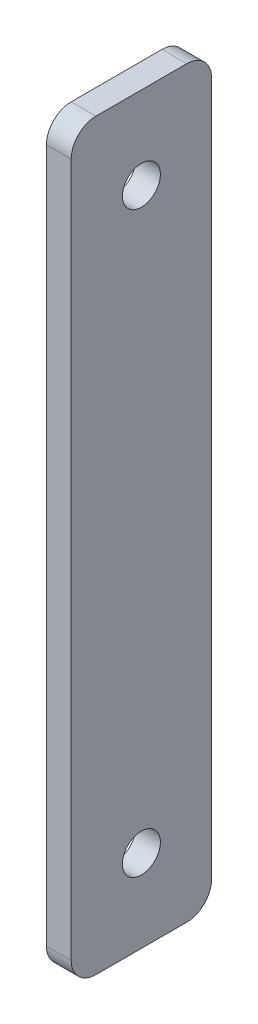
ISO-10303-21;
HEADER;
FILE_DESCRIPTION(('STEP AP214'),'2;1');
FILE_NAME('part.step','',(''),(''),'','','');
FILE_SCHEMA(('AUTOMOTIVE_DESIGN { 1 0 10303 214 1 1 1 1 }'));
ENDSEC;
DATA;
#1=APPLICATION_CONTEXT('core data for automotive mechanical design processes');
#2=APPLICATION_PROTOCOL_DEFINITION('international standard','automotive_design',2000,#1);
#3=PRODUCT_CONTEXT('',#1,'mechanical');
#4=PRODUCT('Part','Part','',(#3));
#5=PRODUCT_RELATED_PRODUCT_CATEGORY('part','',(#4));
#6=PRODUCT_DEFINITION_FORMATION('','',#4);
#7=PRODUCT_DEFINITION_CONTEXT('part definition',#1,'design');
#8=PRODUCT_DEFINITION('design','',#6,#7);
#9=PRODUCT_DEFINITION_SHAPE('','',#8);
#10=(LENGTH_UNIT() NAMED_UNIT(*) SI_UNIT(.MILLI.,.METRE.));
#11=(NAMED_UNIT(*) PLANE_ANGLE_UNIT() SI_UNIT($,.RADIAN.));
#12=(NAMED_UNIT(*) SI_UNIT($,.STERADIAN.) SOLID_ANGLE_UNIT());
#13=UNCERTAINTY_MEASURE_WITH_UNIT(LENGTH_MEASURE(1.E-05),#10,'distance_accuracy_value','');
#14=(GEOMETRIC_REPRESENTATION_CONTEXT(3) GLOBAL_UNCERTAINTY_ASSIGNED_CONTEXT((#13)) GLOBAL_UNIT_ASSIGNED_CONTEXT((#10,
#11,#12)) REPRESENTATION_CONTEXT('',''));
#15=CARTESIAN_POINT('',(0.,0.,0.));
#16=DIRECTION('',(0.,0.,1.));
#17=DIRECTION('',(1.,0.,0.));
#18=AXIS2_PLACEMENT_3D('',#15,#16,#17);
#19=CARTESIAN_POINT('',(3.,87.,-5.5));
#20=DIRECTION('',(1.,0.,0.));
#21=DIRECTION('',(0.,0.,-1.));
#22=AXIS2_PLACEMENT_3D('',#19,#20,#21);
#23=PLANE('',#22);
#24=CARTESIAN_POINT('',(3.,10.,0.));
#25=DIRECTION('',(1.,0.,0.));
#26=DIRECTION('',(0.,0.,-1.));
#27=AXIS2_PLACEMENT_3D('',#24,#25,#26);
#28=CIRCLE('',#27,2.3);
#29=CARTESIAN_POINT('',(3.,10.,-2.3));
#30=VERTEX_POINT('',#29);
#31=EDGE_CURVE('E136',#30,#30,#28,.T.);
#32=ORIENTED_EDGE('',*,*,#31,.F.);
#33=EDGE_LOOP('',(#32));
#34=FACE_BOUND('',#33,.T.);
#35=CARTESIAN_POINT('',(3.,87.,-5.5));
#36=DIRECTION('',(1.,0.,0.));
#37=DIRECTION('',(0.,0.,-1.));
#38=AXIS2_PLACEMENT_3D('',#35,#36,#37);
#39=CIRCLE('',#38,2.99999999999999);
#40=CARTESIAN_POINT('',(3.,87.,-8.5));
#41=VERTEX_POINT('',#40);
#42=CARTESIAN_POINT('',(3.,90.,-5.5));
#43=VERTEX_POINT('',#42);
#44=EDGE_CURVE('E147',#41,#43,#39,.T.);
#45=ORIENTED_EDGE('',*,*,#44,.T.);
#46=DIRECTION('',(0.,0.,1.));
#47=VECTOR('',#46,1.);
#48=CARTESIAN_POINT('',(3.,90.,-5.5));
#49=LINE('',#48,#47);
#50=CARTESIAN_POINT('',(3.,90.,5.5));
#51=VERTEX_POINT('',#50);
#52=EDGE_CURVE('E95',#43,#51,#49,.T.);
#53=ORIENTED_EDGE('',*,*,#52,.T.);
#54=CARTESIAN_POINT('',(3.,87.,5.5));
#55=DIRECTION('',(1.,0.,0.));
#56=DIRECTION('',(0.,0.,1.));
#57=AXIS2_PLACEMENT_3D('',#54,#55,#56);
#58=CIRCLE('',#57,2.99999999999999);
#59=CARTESIAN_POINT('',(3.,87.,8.5));
#60=VERTEX_POINT('',#59);
#61=EDGE_CURVE('E162',#51,#60,#58,.T.);
#62=ORIENTED_EDGE('',*,*,#61,.T.);
#63=DIRECTION('',(0.,-1.,0.));
#64=VECTOR('',#63,1.);
#65=CARTESIAN_POINT('',(3.,3.,8.5));
#66=LINE('',#65,#64);
#67=CARTESIAN_POINT('',(3.,3.,8.5));
#68=VERTEX_POINT('',#67);
#69=EDGE_CURVE('E175',#60,#68,#66,.T.);
#70=ORIENTED_EDGE('',*,*,#69,.T.);
#71=CARTESIAN_POINT('',(3.,3.,5.5));
#72=DIRECTION('',(1.,0.,0.));
#73=DIRECTION('',(0.,0.,1.));
#74=AXIS2_PLACEMENT_3D('',#71,#72,#73);
#75=CIRCLE('',#74,3.);
#76=CARTESIAN_POINT('',(3.,0.,5.5));
#77=VERTEX_POINT('',#76);
#78=EDGE_CURVE('E114',#68,#77,#75,.T.);
#79=ORIENTED_EDGE('',*,*,#78,.T.);
#80=DIRECTION('',(0.,0.,-1.));
#81=VECTOR('',#80,1.);
#82=CARTESIAN_POINT('',(3.,0.,5.5));
#83=LINE('',#82,#81);
#84=CARTESIAN_POINT('',(3.,0.,-5.5));
#85=VERTEX_POINT('',#84);
#86=EDGE_CURVE('E108',#77,#85,#83,.T.);
#87=ORIENTED_EDGE('',*,*,#86,.T.);
#88=CARTESIAN_POINT('',(3.,3.,-5.5));
#89=DIRECTION('',(1.,0.,0.));
#90=DIRECTION('',(0.,0.,-1.));
#91=AXIS2_PLACEMENT_3D('',#88,#89,#90);
#92=CIRCLE('',#91,3.);
#93=CARTESIAN_POINT('',(3.,3.,-8.5));
#94=VERTEX_POINT('',#93);
#95=EDGE_CURVE('E112',#85,#94,#92,.T.);
#96=ORIENTED_EDGE('',*,*,#95,.T.);
#97=DIRECTION('',(0.,1.,0.));
#98=VECTOR('',#97,1.);
#99=CARTESIAN_POINT('',(3.,3.,-8.5));
#100=LINE('',#99,#98);
#101=EDGE_CURVE('E52',#94,#41,#100,.T.);
#102=ORIENTED_EDGE('',*,*,#101,.T.);
#103=EDGE_LOOP('',(#45,#53,#62,#70,#79,#87,#96,#102));
#104=FACE_BOUND('',#103,.T.);
#105=CARTESIAN_POINT('',(3.,80.,0.));
#106=DIRECTION('',(1.,0.,0.));
#107=DIRECTION('',(0.,0.,1.));
#108=AXIS2_PLACEMENT_3D('',#105,#106,#107);
#109=CIRCLE('',#108,2.29999999999999);
#110=CARTESIAN_POINT('',(3.,80.,2.29999999999999));
#111=VERTEX_POINT('',#110);
#112=EDGE_CURVE('E184',#111,#111,#109,.T.);
#113=ORIENTED_EDGE('',*,*,#112,.F.);
#114=EDGE_LOOP('',(#113));
#115=FACE_BOUND('',#114,.T.);
#116=ADVANCED_FACE('F35',(#34,#104,#115),#23,.T.);
#117=CARTESIAN_POINT('',(0.,87.,-5.5));
#118=DIRECTION('',(1.,0.,0.));
#119=DIRECTION('',(0.,0.,-1.));
#120=AXIS2_PLACEMENT_3D('',#117,#118,#119);
#121=PLANE('',#120);
#122=CARTESIAN_POINT('',(0.,10.,0.));
#123=DIRECTION('',(1.,0.,0.));
#124=DIRECTION('',(0.,0.,-1.));
#125=AXIS2_PLACEMENT_3D('',#122,#123,#124);
#126=CIRCLE('',#125,2.3);
#127=CARTESIAN_POINT('',(0.,10.,-2.3));
#128=VERTEX_POINT('',#127);
#129=EDGE_CURVE('E181',#128,#128,#126,.T.);
#130=ORIENTED_EDGE('',*,*,#129,.T.);
#131=EDGE_LOOP('',(#130));
#132=FACE_BOUND('',#131,.T.);
#133=CARTESIAN_POINT('',(0.,87.,-5.5));
#134=DIRECTION('',(1.,0.,0.));
#135=DIRECTION('',(0.,0.,-1.));
#136=AXIS2_PLACEMENT_3D('',#133,#134,#135);
#137=CIRCLE('',#136,2.99999999999999);
#138=CARTESIAN_POINT('',(0.,87.,-8.5));
#139=VERTEX_POINT('',#138);
#140=CARTESIAN_POINT('',(0.,90.,-5.5));
#141=VERTEX_POINT('',#140);
#142=EDGE_CURVE('E132',#139,#141,#137,.T.);
#143=ORIENTED_EDGE('',*,*,#142,.F.);
#144=DIRECTION('',(0.,1.,0.));
#145=VECTOR('',#144,1.);
#146=CARTESIAN_POINT('',(0.,3.,-8.5));
#147=LINE('',#146,#145);
#148=CARTESIAN_POINT('',(0.,3.,-8.5));
#149=VERTEX_POINT('',#148);
#150=EDGE_CURVE('E87',#149,#139,#147,.T.);
#151=ORIENTED_EDGE('',*,*,#150,.F.);
#152=CARTESIAN_POINT('',(0.,3.,-5.5));
#153=DIRECTION('',(1.,0.,0.));
#154=DIRECTION('',(0.,0.,-1.));
#155=AXIS2_PLACEMENT_3D('',#152,#153,#154);
#156=CIRCLE('',#155,3.);
#157=CARTESIAN_POINT('',(0.,0.,-5.5));
#158=VERTEX_POINT('',#157);
#159=EDGE_CURVE('E81',#158,#149,#156,.T.);
#160=ORIENTED_EDGE('',*,*,#159,.F.);
#161=DIRECTION('',(0.,0.,-1.));
#162=VECTOR('',#161,1.);
#163=CARTESIAN_POINT('',(0.,0.,5.5));
#164=LINE('',#163,#162);
#165=CARTESIAN_POINT('',(0.,0.,5.5));
#166=VERTEX_POINT('',#165);
#167=EDGE_CURVE('E122',#166,#158,#164,.T.);
#168=ORIENTED_EDGE('',*,*,#167,.F.);
#169=CARTESIAN_POINT('',(0.,3.,5.5));
#170=DIRECTION('',(1.,0.,0.));
#171=DIRECTION('',(0.,0.,1.));
#172=AXIS2_PLACEMENT_3D('',#169,#170,#171);
#173=CIRCLE('',#172,3.);
#174=CARTESIAN_POINT('',(0.,3.,8.5));
#175=VERTEX_POINT('',#174);
#176=EDGE_CURVE('E142',#175,#166,#173,.T.);
#177=ORIENTED_EDGE('',*,*,#176,.F.);
#178=DIRECTION('',(0.,-1.,0.));
#179=VECTOR('',#178,1.);
#180=CARTESIAN_POINT('',(0.,3.,8.5));
#181=LINE('',#180,#179);
#182=CARTESIAN_POINT('',(0.,87.,8.5));
#183=VERTEX_POINT('',#182);
#184=EDGE_CURVE('E140',#183,#175,#181,.T.);
#185=ORIENTED_EDGE('',*,*,#184,.F.);
#186=CARTESIAN_POINT('',(0.,87.,5.5));
#187=DIRECTION('',(1.,0.,0.));
#188=DIRECTION('',(0.,0.,1.));
#189=AXIS2_PLACEMENT_3D('',#186,#187,#188);
#190=CIRCLE('',#189,2.99999999999999);
#191=CARTESIAN_POINT('',(0.,90.,5.5));
#192=VERTEX_POINT('',#191);
#193=EDGE_CURVE('E138',#192,#183,#190,.T.);
#194=ORIENTED_EDGE('',*,*,#193,.F.);
#195=DIRECTION('',(0.,0.,1.));
#196=VECTOR('',#195,1.);
#197=CARTESIAN_POINT('',(0.,90.,-5.5));
#198=LINE('',#197,#196);
#199=EDGE_CURVE('E135',#141,#192,#198,.T.);
#200=ORIENTED_EDGE('',*,*,#199,.F.);
#201=EDGE_LOOP('',(#143,#151,#160,#168,#177,#185,#194,#200));
#202=FACE_BOUND('',#201,.T.);
#203=CARTESIAN_POINT('',(0.,80.,0.));
#204=DIRECTION('',(1.,0.,0.));
#205=DIRECTION('',(0.,0.,1.));
#206=AXIS2_PLACEMENT_3D('',#203,#204,#205);
#207=CIRCLE('',#206,2.29999999999999);
#208=CARTESIAN_POINT('',(0.,80.,2.29999999999999));
#209=VERTEX_POINT('',#208);
#210=EDGE_CURVE('E187',#209,#209,#207,.T.);
#211=ORIENTED_EDGE('',*,*,#210,.T.);
#212=EDGE_LOOP('',(#211));
#213=FACE_BOUND('',#212,.T.);
#214=ADVANCED_FACE('F166',(#132,#202,#213),#121,.F.);
#215=CARTESIAN_POINT('',(3.,87.,-5.5));
#216=DIRECTION('',(-1.,0.,0.));
#217=DIRECTION('',(0.,0.,1.));
#218=AXIS2_PLACEMENT_3D('',#215,#216,#217);
#219=CYLINDRICAL_SURFACE('',#218,2.99999999999999);
#220=ORIENTED_EDGE('',*,*,#142,.T.);
#221=DIRECTION('',(-1.,0.,0.));
#222=VECTOR('',#221,1.);
#223=CARTESIAN_POINT('',(3.,90.,-5.5));
#224=LINE('',#223,#222);
#225=EDGE_CURVE('E11',#43,#141,#224,.T.);
#226=ORIENTED_EDGE('',*,*,#225,.F.);
#227=ORIENTED_EDGE('',*,*,#44,.F.);
#228=DIRECTION('',(-1.,0.,0.));
#229=VECTOR('',#228,1.);
#230=CARTESIAN_POINT('',(3.,87.,-8.5));
#231=LINE('',#230,#229);
#232=EDGE_CURVE('E128',#41,#139,#231,.T.);
#233=ORIENTED_EDGE('',*,*,#232,.T.);
#234=EDGE_LOOP('',(#220,#226,#227,#233));
#235=FACE_BOUND('',#234,.T.);
#236=ADVANCED_FACE('F37',(#235),#219,.T.);
#237=CARTESIAN_POINT('',(3.,90.,-5.5));
#238=DIRECTION('',(0.,-1.,0.));
#239=DIRECTION('',(0.,0.,-1.));
#240=AXIS2_PLACEMENT_3D('',#237,#238,#239);
#241=PLANE('',#240);
#242=ORIENTED_EDGE('',*,*,#199,.T.);
#243=DIRECTION('',(-1.,0.,0.));
#244=VECTOR('',#243,1.);
#245=CARTESIAN_POINT('',(3.,90.,5.5));
#246=LINE('',#245,#244);
#247=EDGE_CURVE('E44',#51,#192,#246,.T.);
#248=ORIENTED_EDGE('',*,*,#247,.F.);
#249=ORIENTED_EDGE('',*,*,#52,.F.);
#250=ORIENTED_EDGE('',*,*,#225,.T.);
#251=EDGE_LOOP('',(#242,#248,#249,#250));
#252=FACE_BOUND('',#251,.T.);
#253=ADVANCED_FACE('F220',(#252),#241,.F.);
#254=CARTESIAN_POINT('',(3.,87.,5.5));
#255=DIRECTION('',(-1.,0.,0.));
#256=DIRECTION('',(0.,0.,1.));
#257=AXIS2_PLACEMENT_3D('',#254,#255,#256);
#258=CYLINDRICAL_SURFACE('',#257,2.99999999999999);
#259=ORIENTED_EDGE('',*,*,#193,.T.);
#260=DIRECTION('',(-1.,0.,0.));
#261=VECTOR('',#260,1.);
#262=CARTESIAN_POINT('',(3.,87.,8.5));
#263=LINE('',#262,#261);
#264=EDGE_CURVE('E154',#60,#183,#263,.T.);
#265=ORIENTED_EDGE('',*,*,#264,.F.);
#266=ORIENTED_EDGE('',*,*,#61,.F.);
#267=ORIENTED_EDGE('',*,*,#247,.T.);
#268=EDGE_LOOP('',(#259,#265,#266,#267));
#269=FACE_BOUND('',#268,.T.);
#270=ADVANCED_FACE('F160',(#269),#258,.T.);
#271=CARTESIAN_POINT('',(3.,3.,8.5));
#272=DIRECTION('',(0.,0.,-1.));
#273=DIRECTION('',(-1.,0.,0.));
#274=AXIS2_PLACEMENT_3D('',#271,#272,#273);
#275=PLANE('',#274);
#276=ORIENTED_EDGE('',*,*,#184,.T.);
#277=DIRECTION('',(-1.,0.,0.));
#278=VECTOR('',#277,1.);
#279=CARTESIAN_POINT('',(3.,3.,8.5));
#280=LINE('',#279,#278);
#281=EDGE_CURVE('E151',#68,#175,#280,.T.);
#282=ORIENTED_EDGE('',*,*,#281,.F.);
#283=ORIENTED_EDGE('',*,*,#69,.F.);
#284=ORIENTED_EDGE('',*,*,#264,.T.);
#285=EDGE_LOOP('',(#276,#282,#283,#284));
#286=FACE_BOUND('',#285,.T.);
#287=ADVANCED_FACE('F171',(#286),#275,.F.);
#288=CARTESIAN_POINT('',(3.,3.,5.5));
#289=DIRECTION('',(-1.,0.,0.));
#290=DIRECTION('',(0.,0.,1.));
#291=AXIS2_PLACEMENT_3D('',#288,#289,#290);
#292=CYLINDRICAL_SURFACE('',#291,3.);
#293=ORIENTED_EDGE('',*,*,#176,.T.);
#294=DIRECTION('',(-1.,0.,0.));
#295=VECTOR('',#294,1.);
#296=CARTESIAN_POINT('',(3.,0.,5.5));
#297=LINE('',#296,#295);
#298=EDGE_CURVE('E123',#77,#166,#297,.T.);
#299=ORIENTED_EDGE('',*,*,#298,.F.);
#300=ORIENTED_EDGE('',*,*,#78,.F.);
#301=ORIENTED_EDGE('',*,*,#281,.T.);
#302=EDGE_LOOP('',(#293,#299,#300,#301));
#303=FACE_BOUND('',#302,.T.);
#304=ADVANCED_FACE('F174',(#303),#292,.T.);
#305=CARTESIAN_POINT('',(3.,0.,5.5));
#306=DIRECTION('',(0.,1.,0.));
#307=DIRECTION('',(0.,0.,1.));
#308=AXIS2_PLACEMENT_3D('',#305,#306,#307);
#309=PLANE('',#308);
#310=ORIENTED_EDGE('',*,*,#167,.T.);
#311=DIRECTION('',(-1.,0.,0.));
#312=VECTOR('',#311,1.);
#313=CARTESIAN_POINT('',(3.,0.,-5.5));
#314=LINE('',#313,#312);
#315=EDGE_CURVE('E119',#85,#158,#314,.T.);
#316=ORIENTED_EDGE('',*,*,#315,.F.);
#317=ORIENTED_EDGE('',*,*,#86,.F.);
#318=ORIENTED_EDGE('',*,*,#298,.T.);
#319=EDGE_LOOP('',(#310,#316,#317,#318));
#320=FACE_BOUND('',#319,.T.);
#321=ADVANCED_FACE('F120',(#320),#309,.F.);
#322=CARTESIAN_POINT('',(3.,3.,-5.5));
#323=DIRECTION('',(-1.,0.,0.));
#324=DIRECTION('',(0.,0.,1.));
#325=AXIS2_PLACEMENT_3D('',#322,#323,#324);
#326=CYLINDRICAL_SURFACE('',#325,3.);
#327=ORIENTED_EDGE('',*,*,#159,.T.);
#328=DIRECTION('',(-1.,0.,0.));
#329=VECTOR('',#328,1.);
#330=CARTESIAN_POINT('',(3.,3.,-8.5));
#331=LINE('',#330,#329);
#332=EDGE_CURVE('E124',#94,#149,#331,.T.);
#333=ORIENTED_EDGE('',*,*,#332,.F.);
#334=ORIENTED_EDGE('',*,*,#95,.F.);
#335=ORIENTED_EDGE('',*,*,#315,.T.);
#336=EDGE_LOOP('',(#327,#333,#334,#335));
#337=FACE_BOUND('',#336,.T.);
#338=ADVANCED_FACE('F126',(#337),#326,.T.);
#339=CARTESIAN_POINT('',(3.,3.,-8.5));
#340=DIRECTION('',(0.,0.,1.));
#341=DIRECTION('',(1.,0.,0.));
#342=AXIS2_PLACEMENT_3D('',#339,#340,#341);
#343=PLANE('',#342);
#344=ORIENTED_EDGE('',*,*,#150,.T.);
#345=ORIENTED_EDGE('',*,*,#232,.F.);
#346=ORIENTED_EDGE('',*,*,#101,.F.);
#347=ORIENTED_EDGE('',*,*,#332,.T.);
#348=EDGE_LOOP('',(#344,#345,#346,#347));
#349=FACE_BOUND('',#348,.T.);
#350=ADVANCED_FACE('F208',(#349),#343,.F.);
#351=CARTESIAN_POINT('',(3.,10.,0.));
#352=DIRECTION('',(-1.,0.,0.));
#353=DIRECTION('',(0.,0.,1.));
#354=AXIS2_PLACEMENT_3D('',#351,#352,#353);
#355=CYLINDRICAL_SURFACE('',#354,2.3);
#356=ORIENTED_EDGE('',*,*,#31,.T.);
#357=EDGE_LOOP('',(#356));
#358=FACE_BOUND('',#357,.T.);
#359=ORIENTED_EDGE('',*,*,#129,.F.);
#360=EDGE_LOOP('',(#359));
#361=FACE_BOUND('',#360,.T.);
#362=ADVANCED_FACE('F205',(#358,#361),#355,.F.);
#363=CARTESIAN_POINT('',(3.,80.,0.));
#364=DIRECTION('',(-1.,0.,0.));
#365=DIRECTION('',(0.,0.,1.));
#366=AXIS2_PLACEMENT_3D('',#363,#364,#365);
#367=CYLINDRICAL_SURFACE('',#366,2.29999999999999);
#368=ORIENTED_EDGE('',*,*,#112,.T.);
#369=EDGE_LOOP('',(#368));
#370=FACE_BOUND('',#369,.T.);
#371=ORIENTED_EDGE('',*,*,#210,.F.);
#372=EDGE_LOOP('',(#371));
#373=FACE_BOUND('',#372,.T.);
#374=ADVANCED_FACE('F193',(#370,#373),#367,.F.);
#375=CLOSED_SHELL('',(#116,#214,#236,#253,#270,#287,#304,#321,#338,#350,#362,#374));
#376=MANIFOLD_SOLID_BREP('B2',#375);
#377=ADVANCED_BREP_SHAPE_REPRESENTATION('',(#18,#376),#14);
#378=SHAPE_DEFINITION_REPRESENTATION(#9,#377);
ENDSEC;
END-ISO-10303-21;
